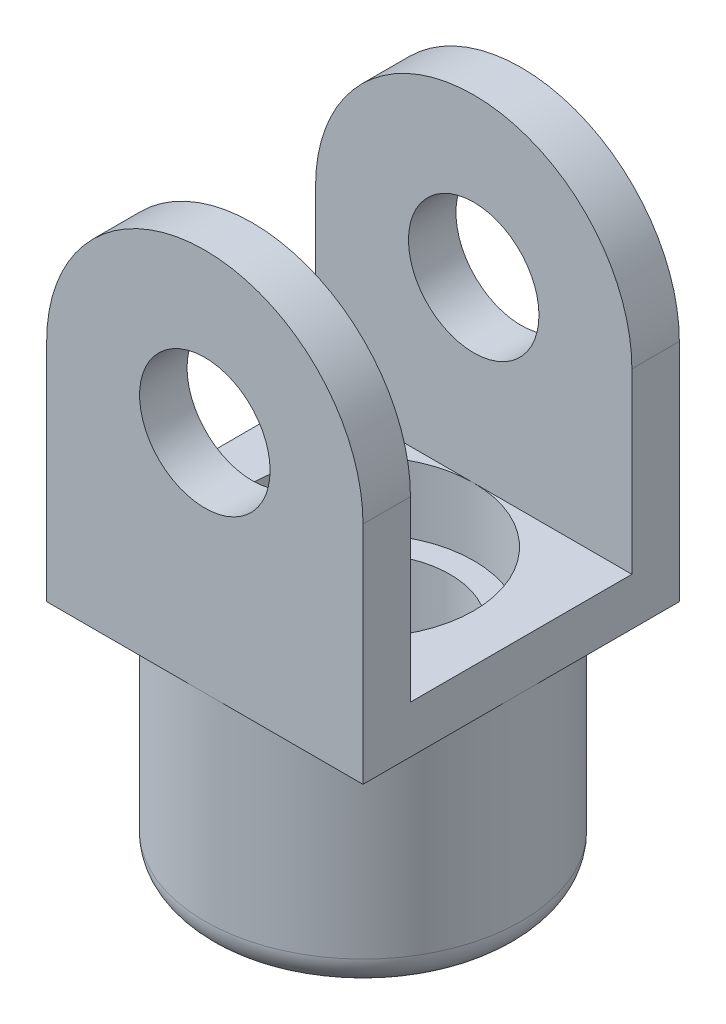
ISO-10303-21;
HEADER;
FILE_DESCRIPTION(('STEP AP214'),'2;1');
FILE_NAME('part.step','',(''),(''),'','','');
FILE_SCHEMA(('AUTOMOTIVE_DESIGN { 1 0 10303 214 1 1 1 1 }'));
ENDSEC;
DATA;
#1=APPLICATION_CONTEXT('core data for automotive mechanical design processes');
#2=APPLICATION_PROTOCOL_DEFINITION('international standard','automotive_design',2000,#1);
#3=PRODUCT_CONTEXT('',#1,'mechanical');
#4=PRODUCT('Part','Part','',(#3));
#5=PRODUCT_RELATED_PRODUCT_CATEGORY('part','',(#4));
#6=PRODUCT_DEFINITION_FORMATION('','',#4);
#7=PRODUCT_DEFINITION_CONTEXT('part definition',#1,'design');
#8=PRODUCT_DEFINITION('design','',#6,#7);
#9=PRODUCT_DEFINITION_SHAPE('','',#8);
#10=(LENGTH_UNIT() NAMED_UNIT(*) SI_UNIT(.MILLI.,.METRE.));
#11=(NAMED_UNIT(*) PLANE_ANGLE_UNIT() SI_UNIT($,.RADIAN.));
#12=(NAMED_UNIT(*) SI_UNIT($,.STERADIAN.) SOLID_ANGLE_UNIT());
#13=UNCERTAINTY_MEASURE_WITH_UNIT(LENGTH_MEASURE(1.E-05),#10,'distance_accuracy_value','');
#14=(GEOMETRIC_REPRESENTATION_CONTEXT(3) GLOBAL_UNCERTAINTY_ASSIGNED_CONTEXT((#13)) GLOBAL_UNIT_ASSIGNED_CONTEXT((#10,
#11,#12)) REPRESENTATION_CONTEXT('',''));
#15=CARTESIAN_POINT('',(0.,0.,0.));
#16=DIRECTION('',(0.,0.,1.));
#17=DIRECTION('',(1.,0.,0.));
#18=AXIS2_PLACEMENT_3D('',#15,#16,#17);
#19=CARTESIAN_POINT('',(0.,12.319,0.));
#20=DIRECTION('',(0.,-1.,0.));
#21=DIRECTION('',(1.,0.,0.));
#22=AXIS2_PLACEMENT_3D('',#19,#20,#21);
#23=CYLINDRICAL_SURFACE('',#22,2.794);
#24=CARTESIAN_POINT('',(0.,-0.635,0.));
#25=DIRECTION('',(0.,1.,0.));
#26=DIRECTION('',(-1.,0.,0.));
#27=AXIS2_PLACEMENT_3D('',#24,#25,#26);
#28=CIRCLE('',#27,2.794);
#29=CARTESIAN_POINT('',(-2.794,-0.635,0.));
#30=VERTEX_POINT('',#29);
#31=EDGE_CURVE('E208',#30,#30,#28,.F.);
#32=ORIENTED_EDGE('',*,*,#31,.F.);
#33=EDGE_LOOP('',(#32));
#34=FACE_BOUND('',#33,.T.);
#35=CARTESIAN_POINT('',(0.,-5.207,0.));
#36=DIRECTION('',(0.,-1.,0.));
#37=DIRECTION('',(1.,0.,0.));
#38=AXIS2_PLACEMENT_3D('',#35,#36,#37);
#39=CIRCLE('',#38,2.794);
#40=CARTESIAN_POINT('',(2.794,-5.207,0.));
#41=VERTEX_POINT('',#40);
#42=EDGE_CURVE('E118',#41,#41,#39,.F.);
#43=ORIENTED_EDGE('',*,*,#42,.F.);
#44=EDGE_LOOP('',(#43));
#45=FACE_BOUND('',#44,.T.);
#46=ADVANCED_FACE('F32',(#34,#45),#23,.F.);
#47=CARTESIAN_POINT('',(-5.08,1.524,5.08));
#48=DIRECTION('',(0.,1.,0.));
#49=DIRECTION('',(-1.,0.,0.));
#50=AXIS2_PLACEMENT_3D('',#47,#48,#49);
#51=PLANE('',#50);
#52=CARTESIAN_POINT('',(0.,1.524,0.));
#53=DIRECTION('',(0.,1.,0.));
#54=DIRECTION('',(-1.,0.,0.));
#55=AXIS2_PLACEMENT_3D('',#52,#53,#54);
#56=CIRCLE('',#55,3.556);
#57=CARTESIAN_POINT('',(0.,1.524,3.556));
#58=VERTEX_POINT('',#57);
#59=CARTESIAN_POINT('',(0.,1.524,-3.556));
#60=VERTEX_POINT('',#59);
#61=EDGE_CURVE('E46',#58,#60,#56,.T.);
#62=ORIENTED_EDGE('',*,*,#61,.F.);
#63=DIRECTION('',(1.,0.,0.));
#64=VECTOR('',#63,1.);
#65=CARTESIAN_POINT('',(0.,1.524,3.556));
#66=LINE('',#65,#64);
#67=CARTESIAN_POINT('',(5.08,1.524,3.556));
#68=VERTEX_POINT('',#67);
#69=EDGE_CURVE('E124',#58,#68,#66,.T.);
#70=ORIENTED_EDGE('',*,*,#69,.T.);
#71=DIRECTION('',(0.,0.,-1.));
#72=VECTOR('',#71,1.);
#73=CARTESIAN_POINT('',(5.08,1.524,5.08));
#74=LINE('',#73,#72);
#75=CARTESIAN_POINT('',(5.08,1.524,-3.556));
#76=VERTEX_POINT('',#75);
#77=EDGE_CURVE('E141',#68,#76,#74,.T.);
#78=ORIENTED_EDGE('',*,*,#77,.T.);
#79=DIRECTION('',(1.,0.,0.));
#80=VECTOR('',#79,1.);
#81=CARTESIAN_POINT('',(0.,1.524,-3.556));
#82=LINE('',#81,#80);
#83=EDGE_CURVE('E126',#60,#76,#82,.T.);
#84=ORIENTED_EDGE('',*,*,#83,.F.);
#85=EDGE_LOOP('',(#62,#70,#78,#84));
#86=FACE_BOUND('',#85,.T.);
#87=ADVANCED_FACE('F122',(#86),#51,.T.);
#88=CARTESIAN_POINT('',(-5.08,0.,5.08));
#89=DIRECTION('',(0.,1.,0.));
#90=DIRECTION('',(-1.,0.,0.));
#91=AXIS2_PLACEMENT_3D('',#88,#89,#90);
#92=PLANE('',#91);
#93=CARTESIAN_POINT('',(0.,0.,0.));
#94=DIRECTION('',(0.,-1.,0.));
#95=DIRECTION('',(1.,0.,0.));
#96=AXIS2_PLACEMENT_3D('',#93,#94,#95);
#97=CIRCLE('',#96,5.08);
#98=CARTESIAN_POINT('',(5.08,0.,0.));
#99=VERTEX_POINT('',#98);
#100=CARTESIAN_POINT('',(0.,0.,5.08));
#101=VERTEX_POINT('',#100);
#102=EDGE_CURVE('E211',#99,#101,#97,.T.);
#103=ORIENTED_EDGE('',*,*,#102,.F.);
#104=DIRECTION('',(0.,0.,-1.));
#105=VECTOR('',#104,1.);
#106=CARTESIAN_POINT('',(5.08,0.,5.08));
#107=LINE('',#106,#105);
#108=CARTESIAN_POINT('',(5.08,0.,5.08));
#109=VERTEX_POINT('',#108);
#110=EDGE_CURVE('E194',#109,#99,#107,.T.);
#111=ORIENTED_EDGE('',*,*,#110,.F.);
#112=DIRECTION('',(1.,0.,0.));
#113=VECTOR('',#112,1.);
#114=CARTESIAN_POINT('',(-5.08,0.,5.08));
#115=LINE('',#114,#113);
#116=EDGE_CURVE('E174',#101,#109,#115,.T.);
#117=ORIENTED_EDGE('',*,*,#116,.F.);
#118=EDGE_LOOP('',(#103,#111,#117));
#119=FACE_BOUND('',#118,.T.);
#120=ADVANCED_FACE('F266',(#119),#92,.F.);
#121=CARTESIAN_POINT('',(-5.08,0.,0.));
#122=VERTEX_POINT('',#121);
#123=EDGE_CURVE('E215',#101,#122,#97,.T.);
#124=ORIENTED_EDGE('',*,*,#123,.F.);
#125=CARTESIAN_POINT('',(-5.08,0.,5.08));
#126=VERTEX_POINT('',#125);
#127=EDGE_CURVE('E175',#126,#101,#115,.T.);
#128=ORIENTED_EDGE('',*,*,#127,.F.);
#129=DIRECTION('',(0.,0.,-1.));
#130=VECTOR('',#129,1.);
#131=CARTESIAN_POINT('',(-5.08,0.,5.08));
#132=LINE('',#131,#130);
#133=EDGE_CURVE('E189',#126,#122,#132,.T.);
#134=ORIENTED_EDGE('',*,*,#133,.T.);
#135=EDGE_LOOP('',(#124,#128,#134));
#136=FACE_BOUND('',#135,.T.);
#137=ADVANCED_FACE('F244',(#136),#92,.F.);
#138=CARTESIAN_POINT('',(0.,0.,-5.08));
#139=VERTEX_POINT('',#138);
#140=EDGE_CURVE('E54',#122,#139,#97,.T.);
#141=ORIENTED_EDGE('',*,*,#140,.F.);
#142=CARTESIAN_POINT('',(-5.08,0.,-5.08));
#143=VERTEX_POINT('',#142);
#144=EDGE_CURVE('E193',#122,#143,#132,.T.);
#145=ORIENTED_EDGE('',*,*,#144,.T.);
#146=DIRECTION('',(1.,0.,0.));
#147=VECTOR('',#146,1.);
#148=CARTESIAN_POINT('',(-5.08,0.,-5.08));
#149=LINE('',#148,#147);
#150=EDGE_CURVE('E168',#143,#139,#149,.T.);
#151=ORIENTED_EDGE('',*,*,#150,.T.);
#152=EDGE_LOOP('',(#141,#145,#151));
#153=FACE_BOUND('',#152,.T.);
#154=ADVANCED_FACE('F239',(#153),#92,.F.);
#155=EDGE_CURVE('E192',#139,#99,#97,.T.);
#156=ORIENTED_EDGE('',*,*,#155,.F.);
#157=CARTESIAN_POINT('',(5.08,0.,-5.08));
#158=VERTEX_POINT('',#157);
#159=EDGE_CURVE('E187',#139,#158,#149,.T.);
#160=ORIENTED_EDGE('',*,*,#159,.T.);
#161=EDGE_CURVE('E196',#99,#158,#107,.T.);
#162=ORIENTED_EDGE('',*,*,#161,.F.);
#163=EDGE_LOOP('',(#156,#160,#162));
#164=FACE_BOUND('',#163,.T.);
#165=ADVANCED_FACE('F233',(#164),#92,.F.);
#166=CARTESIAN_POINT('',(-5.08,0.,5.08));
#167=DIRECTION('',(-1.,0.,0.));
#168=DIRECTION('',(0.,-1.,0.));
#169=AXIS2_PLACEMENT_3D('',#166,#167,#168);
#170=PLANE('',#169);
#171=DIRECTION('',(0.,0.,-1.));
#172=VECTOR('',#171,1.);
#173=CARTESIAN_POINT('',(-5.08,1.524,5.08));
#174=LINE('',#173,#172);
#175=CARTESIAN_POINT('',(-5.08,1.524,3.556));
#176=VERTEX_POINT('',#175);
#177=CARTESIAN_POINT('',(-5.08,1.524,-3.556));
#178=VERTEX_POINT('',#177);
#179=EDGE_CURVE('E140',#176,#178,#174,.T.);
#180=ORIENTED_EDGE('',*,*,#179,.T.);
#181=DIRECTION('',(0.,1.,0.));
#182=VECTOR('',#181,1.);
#183=CARTESIAN_POINT('',(-5.08,7.239,-3.556));
#184=LINE('',#183,#182);
#185=CARTESIAN_POINT('',(-5.08,7.239,-3.556));
#186=VERTEX_POINT('',#185);
#187=EDGE_CURVE('E153',#178,#186,#184,.T.);
#188=ORIENTED_EDGE('',*,*,#187,.T.);
#189=DIRECTION('',(0.,0.,-1.));
#190=VECTOR('',#189,1.);
#191=CARTESIAN_POINT('',(-5.08,7.239,5.08));
#192=LINE('',#191,#190);
#193=CARTESIAN_POINT('',(-5.08,7.239,-5.08));
#194=VERTEX_POINT('',#193);
#195=EDGE_CURVE('E178',#186,#194,#192,.T.);
#196=ORIENTED_EDGE('',*,*,#195,.T.);
#197=DIRECTION('',(0.,1.,0.));
#198=VECTOR('',#197,1.);
#199=CARTESIAN_POINT('',(-5.08,0.,-5.08));
#200=LINE('',#199,#198);
#201=EDGE_CURVE('E158',#143,#194,#200,.T.);
#202=ORIENTED_EDGE('',*,*,#201,.F.);
#203=ORIENTED_EDGE('',*,*,#144,.F.);
#204=ORIENTED_EDGE('',*,*,#133,.F.);
#205=DIRECTION('',(0.,1.,0.));
#206=VECTOR('',#205,1.);
#207=CARTESIAN_POINT('',(-5.08,0.,5.08));
#208=LINE('',#207,#206);
#209=CARTESIAN_POINT('',(-5.08,7.239,5.08));
#210=VERTEX_POINT('',#209);
#211=EDGE_CURVE('E164',#126,#210,#208,.T.);
#212=ORIENTED_EDGE('',*,*,#211,.T.);
#213=CARTESIAN_POINT('',(-5.08,7.239,3.556));
#214=VERTEX_POINT('',#213);
#215=EDGE_CURVE('E201',#210,#214,#192,.T.);
#216=ORIENTED_EDGE('',*,*,#215,.T.);
#217=DIRECTION('',(0.,1.,0.));
#218=VECTOR('',#217,1.);
#219=CARTESIAN_POINT('',(-5.08,7.239,3.556));
#220=LINE('',#219,#218);
#221=EDGE_CURVE('E159',#176,#214,#220,.T.);
#222=ORIENTED_EDGE('',*,*,#221,.F.);
#223=EDGE_LOOP('',(#180,#188,#196,#202,#203,#204,#212,#216,#222));
#224=FACE_BOUND('',#223,.T.);
#225=ADVANCED_FACE('F241',(#224),#170,.T.);
#226=CARTESIAN_POINT('',(5.08,7.239,5.08));
#227=DIRECTION('',(1.,0.,0.));
#228=DIRECTION('',(0.,1.,0.));
#229=AXIS2_PLACEMENT_3D('',#226,#227,#228);
#230=PLANE('',#229);
#231=DIRECTION('',(0.,0.,-1.));
#232=VECTOR('',#231,1.);
#233=CARTESIAN_POINT('',(5.08,7.239,5.08));
#234=LINE('',#233,#232);
#235=CARTESIAN_POINT('',(5.08,7.239,-3.556));
#236=VERTEX_POINT('',#235);
#237=CARTESIAN_POINT('',(5.08,7.239,-5.08));
#238=VERTEX_POINT('',#237);
#239=EDGE_CURVE('E200',#236,#238,#234,.T.);
#240=ORIENTED_EDGE('',*,*,#239,.F.);
#241=DIRECTION('',(0.,-1.,0.));
#242=VECTOR('',#241,1.);
#243=CARTESIAN_POINT('',(5.08,7.23900000000001,-3.556));
#244=LINE('',#243,#242);
#245=EDGE_CURVE('E147',#236,#76,#244,.T.);
#246=ORIENTED_EDGE('',*,*,#245,.T.);
#247=ORIENTED_EDGE('',*,*,#77,.F.);
#248=DIRECTION('',(0.,-1.,0.));
#249=VECTOR('',#248,1.);
#250=CARTESIAN_POINT('',(5.08,7.23900000000001,3.556));
#251=LINE('',#250,#249);
#252=CARTESIAN_POINT('',(5.08,7.239,3.556));
#253=VERTEX_POINT('',#252);
#254=EDGE_CURVE('E135',#253,#68,#251,.T.);
#255=ORIENTED_EDGE('',*,*,#254,.F.);
#256=CARTESIAN_POINT('',(5.08,7.239,5.08));
#257=VERTEX_POINT('',#256);
#258=EDGE_CURVE('E197',#257,#253,#234,.T.);
#259=ORIENTED_EDGE('',*,*,#258,.F.);
#260=DIRECTION('',(0.,-1.,0.));
#261=VECTOR('',#260,1.);
#262=CARTESIAN_POINT('',(5.08,7.239,5.08));
#263=LINE('',#262,#261);
#264=EDGE_CURVE('E171',#257,#109,#263,.T.);
#265=ORIENTED_EDGE('',*,*,#264,.T.);
#266=ORIENTED_EDGE('',*,*,#110,.T.);
#267=ORIENTED_EDGE('',*,*,#161,.T.);
#268=DIRECTION('',(0.,-1.,0.));
#269=VECTOR('',#268,1.);
#270=CARTESIAN_POINT('',(5.08,7.239,-5.08));
#271=LINE('',#270,#269);
#272=EDGE_CURVE('E184',#238,#158,#271,.T.);
#273=ORIENTED_EDGE('',*,*,#272,.F.);
#274=EDGE_LOOP('',(#240,#246,#247,#255,#259,#265,#266,#267,#273));
#275=FACE_BOUND('',#274,.T.);
#276=ADVANCED_FACE('F256',(#275),#230,.T.);
#277=CARTESIAN_POINT('',(0.,7.239,5.08));
#278=DIRECTION('',(0.,0.,-1.));
#279=DIRECTION('',(-1.,0.,0.));
#280=AXIS2_PLACEMENT_3D('',#277,#278,#279);
#281=CYLINDRICAL_SURFACE('',#280,5.08);
#282=ORIENTED_EDGE('',*,*,#195,.F.);
#283=CARTESIAN_POINT('',(0.,7.239,-3.556));
#284=DIRECTION('',(0.,0.,-1.));
#285=DIRECTION('',(-1.,0.,0.));
#286=AXIS2_PLACEMENT_3D('',#283,#284,#285);
#287=CIRCLE('',#286,5.08);
#288=EDGE_CURVE('E150',#186,#236,#287,.T.);
#289=ORIENTED_EDGE('',*,*,#288,.T.);
#290=ORIENTED_EDGE('',*,*,#239,.T.);
#291=CARTESIAN_POINT('',(0.,7.239,-5.08));
#292=DIRECTION('',(0.,0.,-1.));
#293=DIRECTION('',(-1.,0.,0.));
#294=AXIS2_PLACEMENT_3D('',#291,#292,#293);
#295=CIRCLE('',#294,5.08);
#296=EDGE_CURVE('E181',#194,#238,#295,.T.);
#297=ORIENTED_EDGE('',*,*,#296,.F.);
#298=EDGE_LOOP('',(#282,#289,#290,#297));
#299=FACE_BOUND('',#298,.T.);
#300=ADVANCED_FACE('F262',(#299),#281,.T.);
#301=CARTESIAN_POINT('',(0.,7.239,3.556));
#302=DIRECTION('',(0.,0.,-1.));
#303=DIRECTION('',(-1.,0.,0.));
#304=AXIS2_PLACEMENT_3D('',#301,#302,#303);
#305=CIRCLE('',#304,5.08);
#306=EDGE_CURVE('E161',#214,#253,#305,.T.);
#307=ORIENTED_EDGE('',*,*,#306,.F.);
#308=ORIENTED_EDGE('',*,*,#215,.F.);
#309=CARTESIAN_POINT('',(0.,7.239,5.08));
#310=DIRECTION('',(0.,0.,-1.));
#311=DIRECTION('',(-1.,0.,0.));
#312=AXIS2_PLACEMENT_3D('',#309,#310,#311);
#313=CIRCLE('',#312,5.08);
#314=EDGE_CURVE('E167',#210,#257,#313,.T.);
#315=ORIENTED_EDGE('',*,*,#314,.T.);
#316=ORIENTED_EDGE('',*,*,#258,.T.);
#317=EDGE_LOOP('',(#307,#308,#315,#316));
#318=FACE_BOUND('',#317,.T.);
#319=ADVANCED_FACE('F253',(#318),#281,.T.);
#320=CARTESIAN_POINT('',(0.,7.239,5.08));
#321=DIRECTION('',(0.,0.,-1.));
#322=DIRECTION('',(-1.,0.,0.));
#323=AXIS2_PLACEMENT_3D('',#320,#321,#322);
#324=PLANE('',#323);
#325=CARTESIAN_POINT('',(0.,7.239,5.08));
#326=DIRECTION('',(0.,0.,1.));
#327=DIRECTION('',(1.,0.,0.));
#328=AXIS2_PLACEMENT_3D('',#325,#326,#327);
#329=CIRCLE('',#328,2.0955);
#330=CARTESIAN_POINT('',(2.0955,7.239,5.08));
#331=VERTEX_POINT('',#330);
#332=EDGE_CURVE('E223',#331,#331,#329,.T.);
#333=ORIENTED_EDGE('',*,*,#332,.F.);
#334=EDGE_LOOP('',(#333));
#335=FACE_BOUND('',#334,.T.);
#336=ORIENTED_EDGE('',*,*,#211,.F.);
#337=ORIENTED_EDGE('',*,*,#127,.T.);
#338=ORIENTED_EDGE('',*,*,#116,.T.);
#339=ORIENTED_EDGE('',*,*,#264,.F.);
#340=ORIENTED_EDGE('',*,*,#314,.F.);
#341=EDGE_LOOP('',(#336,#337,#338,#339,#340));
#342=FACE_BOUND('',#341,.T.);
#343=ADVANCED_FACE('F249',(#335,#342),#324,.F.);
#344=CARTESIAN_POINT('',(0.,7.239,-5.08));
#345=DIRECTION('',(0.,0.,-1.));
#346=DIRECTION('',(-1.,0.,0.));
#347=AXIS2_PLACEMENT_3D('',#344,#345,#346);
#348=PLANE('',#347);
#349=CARTESIAN_POINT('',(0.,7.239,-5.08));
#350=DIRECTION('',(0.,0.,1.));
#351=DIRECTION('',(1.,0.,0.));
#352=AXIS2_PLACEMENT_3D('',#349,#350,#351);
#353=CIRCLE('',#352,2.0955);
#354=CARTESIAN_POINT('',(2.0955,7.239,-5.08));
#355=VERTEX_POINT('',#354);
#356=EDGE_CURVE('E207',#355,#355,#353,.T.);
#357=ORIENTED_EDGE('',*,*,#356,.T.);
#358=EDGE_LOOP('',(#357));
#359=FACE_BOUND('',#358,.T.);
#360=ORIENTED_EDGE('',*,*,#201,.T.);
#361=ORIENTED_EDGE('',*,*,#296,.T.);
#362=ORIENTED_EDGE('',*,*,#272,.T.);
#363=ORIENTED_EDGE('',*,*,#159,.F.);
#364=ORIENTED_EDGE('',*,*,#150,.F.);
#365=EDGE_LOOP('',(#360,#361,#362,#363,#364));
#366=FACE_BOUND('',#365,.T.);
#367=ADVANCED_FACE('F236',(#359,#366),#348,.T.);
#368=EDGE_CURVE('E113',#60,#58,#56,.T.);
#369=ORIENTED_EDGE('',*,*,#368,.F.);
#370=EDGE_CURVE('E144',#178,#60,#82,.T.);
#371=ORIENTED_EDGE('',*,*,#370,.F.);
#372=ORIENTED_EDGE('',*,*,#179,.F.);
#373=EDGE_CURVE('E132',#176,#58,#66,.T.);
#374=ORIENTED_EDGE('',*,*,#373,.T.);
#375=EDGE_LOOP('',(#369,#371,#372,#374));
#376=FACE_BOUND('',#375,.T.);
#377=ADVANCED_FACE('F138',(#376),#51,.T.);
#378=CARTESIAN_POINT('',(0.,7.239,3.556));
#379=DIRECTION('',(0.,0.,-1.));
#380=DIRECTION('',(-1.,0.,0.));
#381=AXIS2_PLACEMENT_3D('',#378,#379,#380);
#382=PLANE('',#381);
#383=CARTESIAN_POINT('',(0.,7.239,3.556));
#384=DIRECTION('',(0.,0.,-1.));
#385=DIRECTION('',(-1.,0.,0.));
#386=AXIS2_PLACEMENT_3D('',#383,#384,#385);
#387=CIRCLE('',#386,2.0955);
#388=CARTESIAN_POINT('',(-2.0955,7.239,3.556));
#389=VERTEX_POINT('',#388);
#390=EDGE_CURVE('E156',#389,#389,#387,.T.);
#391=ORIENTED_EDGE('',*,*,#390,.F.);
#392=EDGE_LOOP('',(#391));
#393=FACE_BOUND('',#392,.T.);
#394=ORIENTED_EDGE('',*,*,#221,.T.);
#395=ORIENTED_EDGE('',*,*,#306,.T.);
#396=ORIENTED_EDGE('',*,*,#254,.T.);
#397=ORIENTED_EDGE('',*,*,#69,.F.);
#398=ORIENTED_EDGE('',*,*,#373,.F.);
#399=EDGE_LOOP('',(#394,#395,#396,#397,#398));
#400=FACE_BOUND('',#399,.T.);
#401=ADVANCED_FACE('F131',(#393,#400),#382,.T.);
#402=CARTESIAN_POINT('',(0.,7.239,-3.556));
#403=DIRECTION('',(0.,0.,-1.));
#404=DIRECTION('',(-1.,0.,0.));
#405=AXIS2_PLACEMENT_3D('',#402,#403,#404);
#406=PLANE('',#405);
#407=CARTESIAN_POINT('',(0.,7.239,-3.556));
#408=DIRECTION('',(0.,0.,-1.));
#409=DIRECTION('',(-1.,0.,0.));
#410=AXIS2_PLACEMENT_3D('',#407,#408,#409);
#411=CIRCLE('',#410,2.0955);
#412=CARTESIAN_POINT('',(-2.0955,7.239,-3.556));
#413=VERTEX_POINT('',#412);
#414=EDGE_CURVE('E204',#413,#413,#411,.T.);
#415=ORIENTED_EDGE('',*,*,#414,.T.);
#416=EDGE_LOOP('',(#415));
#417=FACE_BOUND('',#416,.T.);
#418=ORIENTED_EDGE('',*,*,#187,.F.);
#419=ORIENTED_EDGE('',*,*,#370,.T.);
#420=ORIENTED_EDGE('',*,*,#83,.T.);
#421=ORIENTED_EDGE('',*,*,#245,.F.);
#422=ORIENTED_EDGE('',*,*,#288,.F.);
#423=EDGE_LOOP('',(#418,#419,#420,#421,#422));
#424=FACE_BOUND('',#423,.T.);
#425=ADVANCED_FACE('F259',(#417,#424),#406,.F.);
#426=CARTESIAN_POINT('',(0.,7.239,-5.08));
#427=DIRECTION('',(0.,0.,1.));
#428=DIRECTION('',(1.,0.,0.));
#429=AXIS2_PLACEMENT_3D('',#426,#427,#428);
#430=CYLINDRICAL_SURFACE('',#429,2.0955);
#431=ORIENTED_EDGE('',*,*,#356,.F.);
#432=EDGE_LOOP('',(#431));
#433=FACE_BOUND('',#432,.T.);
#434=ORIENTED_EDGE('',*,*,#414,.F.);
#435=EDGE_LOOP('',(#434));
#436=FACE_BOUND('',#435,.T.);
#437=ADVANCED_FACE('F296',(#433,#436),#430,.F.);
#438=ORIENTED_EDGE('',*,*,#390,.T.);
#439=EDGE_LOOP('',(#438));
#440=FACE_BOUND('',#439,.T.);
#441=ORIENTED_EDGE('',*,*,#332,.T.);
#442=EDGE_LOOP('',(#441));
#443=FACE_BOUND('',#442,.T.);
#444=ADVANCED_FACE('F293',(#440,#443),#430,.F.);
#445=CARTESIAN_POINT('',(0.,-7.366,0.));
#446=DIRECTION('',(0.,1.,0.));
#447=DIRECTION('',(-1.,0.,0.));
#448=AXIS2_PLACEMENT_3D('',#445,#446,#447);
#449=CYLINDRICAL_SURFACE('',#448,5.08);
#450=CARTESIAN_POINT('',(0.,-6.35,0.));
#451=DIRECTION('',(0.,-1.,0.));
#452=DIRECTION('',(1.,0.,0.));
#453=AXIS2_PLACEMENT_3D('',#450,#451,#452);
#454=CIRCLE('',#453,5.08);
#455=CARTESIAN_POINT('',(5.08,-6.35,0.));
#456=VERTEX_POINT('',#455);
#457=EDGE_CURVE('E11',#456,#456,#454,.F.);
#458=ORIENTED_EDGE('',*,*,#457,.T.);
#459=EDGE_LOOP('',(#458));
#460=FACE_BOUND('',#459,.T.);
#461=ORIENTED_EDGE('',*,*,#102,.T.);
#462=ORIENTED_EDGE('',*,*,#123,.T.);
#463=ORIENTED_EDGE('',*,*,#140,.T.);
#464=ORIENTED_EDGE('',*,*,#155,.T.);
#465=EDGE_LOOP('',(#461,#462,#463,#464));
#466=FACE_BOUND('',#465,.T.);
#467=ADVANCED_FACE('F228',(#460,#466),#449,.T.);
#468=CARTESIAN_POINT('',(0.,-7.366,0.));
#469=DIRECTION('',(0.,-1.,0.));
#470=DIRECTION('',(1.,0.,0.));
#471=AXIS2_PLACEMENT_3D('',#468,#469,#470);
#472=PLANE('',#471);
#473=CARTESIAN_POINT('',(0.,-7.366,0.));
#474=DIRECTION('',(0.,-1.,0.));
#475=DIRECTION('',(1.,0.,0.));
#476=AXIS2_PLACEMENT_3D('',#473,#474,#475);
#477=CIRCLE('',#476,4.064);
#478=CARTESIAN_POINT('',(4.064,-7.366,0.));
#479=VERTEX_POINT('',#478);
#480=EDGE_CURVE('E40',#479,#479,#477,.T.);
#481=ORIENTED_EDGE('',*,*,#480,.T.);
#482=EDGE_LOOP('',(#481));
#483=FACE_BOUND('',#482,.T.);
#484=CARTESIAN_POINT('',(0.,-7.366,0.));
#485=DIRECTION('',(0.,-1.,0.));
#486=DIRECTION('',(1.,0.,0.));
#487=AXIS2_PLACEMENT_3D('',#484,#485,#486);
#488=CIRCLE('',#487,3.937);
#489=CARTESIAN_POINT('',(3.937,-7.366,0.));
#490=VERTEX_POINT('',#489);
#491=EDGE_CURVE('E487',#490,#490,#488,.T.);
#492=ORIENTED_EDGE('',*,*,#491,.F.);
#493=EDGE_LOOP('',(#492));
#494=FACE_BOUND('',#493,.T.);
#495=ADVANCED_FACE('F287',(#483,#494),#472,.T.);
#496=CARTESIAN_POINT('',(0.,-0.634999999999999,0.));
#497=DIRECTION('',(0.,1.,0.));
#498=DIRECTION('',(-1.,0.,0.));
#499=AXIS2_PLACEMENT_3D('',#496,#497,#498);
#500=PLANE('',#499);
#501=CARTESIAN_POINT('',(0.,-0.634999999999999,0.));
#502=DIRECTION('',(0.,1.,0.));
#503=DIRECTION('',(-1.,0.,0.));
#504=AXIS2_PLACEMENT_3D('',#501,#502,#503);
#505=CIRCLE('',#504,3.556);
#506=CARTESIAN_POINT('',(-3.556,-0.634999999999999,0.));
#507=VERTEX_POINT('',#506);
#508=EDGE_CURVE('E128',#507,#507,#505,.T.);
#509=ORIENTED_EDGE('',*,*,#508,.T.);
#510=EDGE_LOOP('',(#509));
#511=FACE_BOUND('',#510,.T.);
#512=ORIENTED_EDGE('',*,*,#31,.T.);
#513=EDGE_LOOP('',(#512));
#514=FACE_BOUND('',#513,.T.);
#515=ADVANCED_FACE('F290',(#511,#514),#500,.T.);
#516=CARTESIAN_POINT('',(0.,-0.634999999999999,0.));
#517=DIRECTION('',(0.,1.,0.));
#518=DIRECTION('',(-1.,0.,0.));
#519=AXIS2_PLACEMENT_3D('',#516,#517,#518);
#520=CYLINDRICAL_SURFACE('',#519,3.556);
#521=ORIENTED_EDGE('',*,*,#508,.F.);
#522=EDGE_LOOP('',(#521));
#523=FACE_BOUND('',#522,.T.);
#524=ORIENTED_EDGE('',*,*,#61,.T.);
#525=ORIENTED_EDGE('',*,*,#368,.T.);
#526=EDGE_LOOP('',(#524,#525));
#527=FACE_BOUND('',#526,.T.);
#528=ADVANCED_FACE('F114',(#523,#527),#520,.F.);
#529=CARTESIAN_POINT('',(0.,-5.207,0.));
#530=DIRECTION('',(0.,-1.,0.));
#531=DIRECTION('',(1.,0.,0.));
#532=AXIS2_PLACEMENT_3D('',#529,#530,#531);
#533=PLANE('',#532);
#534=CARTESIAN_POINT('',(0.,-5.207,0.));
#535=DIRECTION('',(0.,-1.,0.));
#536=DIRECTION('',(1.,0.,0.));
#537=AXIS2_PLACEMENT_3D('',#534,#535,#536);
#538=CIRCLE('',#537,3.937);
#539=CARTESIAN_POINT('',(3.937,-5.207,0.));
#540=VERTEX_POINT('',#539);
#541=EDGE_CURVE('E213',#540,#540,#538,.T.);
#542=ORIENTED_EDGE('',*,*,#541,.T.);
#543=EDGE_LOOP('',(#542));
#544=FACE_BOUND('',#543,.T.);
#545=ORIENTED_EDGE('',*,*,#42,.T.);
#546=EDGE_LOOP('',(#545));
#547=FACE_BOUND('',#546,.T.);
#548=ADVANCED_FACE('F353',(#544,#547),#533,.T.);
#549=CARTESIAN_POINT('',(0.,-5.207,0.));
#550=DIRECTION('',(0.,-1.,0.));
#551=DIRECTION('',(1.,0.,0.));
#552=AXIS2_PLACEMENT_3D('',#549,#550,#551);
#553=CYLINDRICAL_SURFACE('',#552,3.937);
#554=ORIENTED_EDGE('',*,*,#541,.F.);
#555=EDGE_LOOP('',(#554));
#556=FACE_BOUND('',#555,.T.);
#557=ORIENTED_EDGE('',*,*,#491,.T.);
#558=EDGE_LOOP('',(#557));
#559=FACE_BOUND('',#558,.T.);
#560=ADVANCED_FACE('F360',(#556,#559),#553,.F.);
#561=CARTESIAN_POINT('',(0.,-6.35,0.));
#562=DIRECTION('',(0.,-1.,0.));
#563=DIRECTION('',(1.,0.,0.));
#564=AXIS2_PLACEMENT_3D('',#561,#562,#563);
#565=TOROIDAL_SURFACE('',#564,4.064,1.016);
#566=ORIENTED_EDGE('',*,*,#457,.F.);
#567=EDGE_LOOP('',(#566));
#568=FACE_BOUND('',#567,.T.);
#569=ORIENTED_EDGE('',*,*,#480,.F.);
#570=EDGE_LOOP('',(#569));
#571=FACE_BOUND('',#570,.T.);
#572=ADVANCED_FACE('F34',(#568,#571),#565,.T.);
#573=CLOSED_SHELL('',(#46,#87,#120,#137,#154,#165,#225,#276,#300,#319,#343,#367,#377,#401,#425,
#437,#444,#467,#495,#515,#528,#548,#560,#572));
#574=MANIFOLD_SOLID_BREP('B2',#573);
#575=ADVANCED_BREP_SHAPE_REPRESENTATION('',(#18,#574),#14);
#576=SHAPE_DEFINITION_REPRESENTATION(#9,#575);
ENDSEC;
END-ISO-10303-21;
